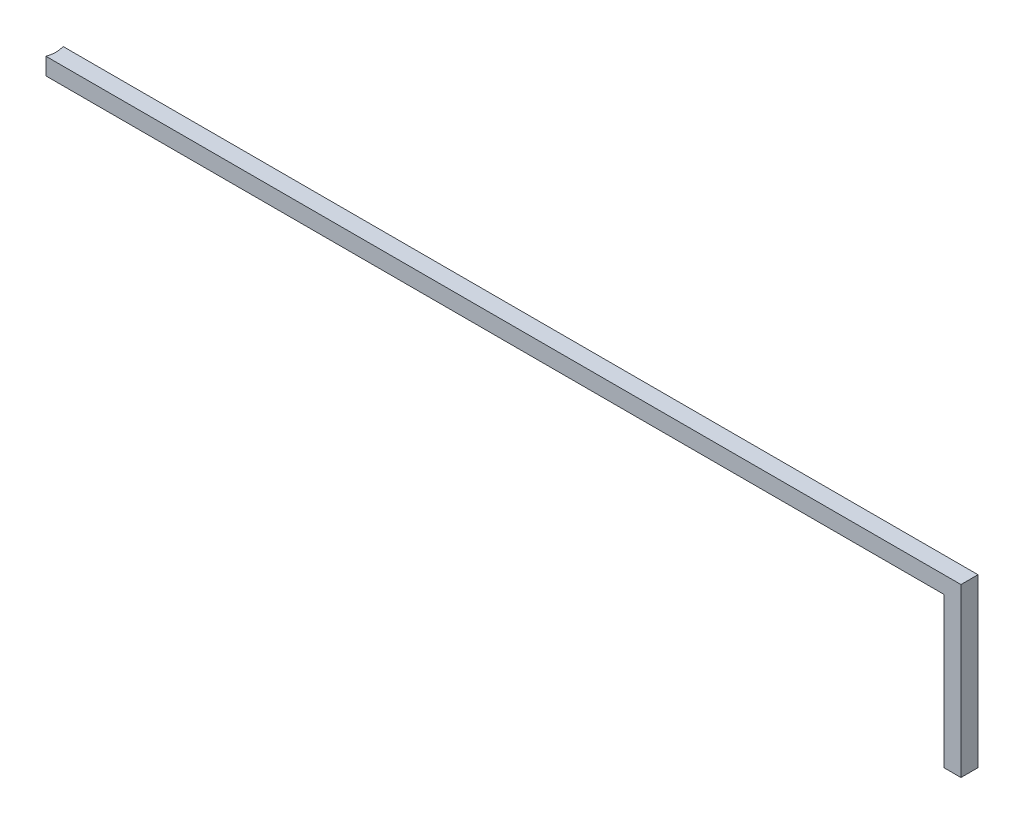
ISO-10303-21;
HEADER;
FILE_DESCRIPTION(('STEP AP214'),'2;1');
FILE_NAME('part.step','',(''),(''),'','','');
FILE_SCHEMA(('AUTOMOTIVE_DESIGN { 1 0 10303 214 1 1 1 1 }'));
ENDSEC;
DATA;
#1=APPLICATION_CONTEXT('core data for automotive mechanical design processes');
#2=APPLICATION_PROTOCOL_DEFINITION('international standard','automotive_design',2000,#1);
#3=PRODUCT_CONTEXT('',#1,'mechanical');
#4=PRODUCT('Part','Part','',(#3));
#5=PRODUCT_RELATED_PRODUCT_CATEGORY('part','',(#4));
#6=PRODUCT_DEFINITION_FORMATION('','',#4);
#7=PRODUCT_DEFINITION_CONTEXT('part definition',#1,'design');
#8=PRODUCT_DEFINITION('design','',#6,#7);
#9=PRODUCT_DEFINITION_SHAPE('','',#8);
#10=(LENGTH_UNIT() NAMED_UNIT(*) SI_UNIT(.MILLI.,.METRE.));
#11=(NAMED_UNIT(*) PLANE_ANGLE_UNIT() SI_UNIT($,.RADIAN.));
#12=(NAMED_UNIT(*) SI_UNIT($,.STERADIAN.) SOLID_ANGLE_UNIT());
#13=UNCERTAINTY_MEASURE_WITH_UNIT(LENGTH_MEASURE(1.E-05),#10,'distance_accuracy_value','');
#14=(GEOMETRIC_REPRESENTATION_CONTEXT(3) GLOBAL_UNCERTAINTY_ASSIGNED_CONTEXT((#13)) GLOBAL_UNIT_ASSIGNED_CONTEXT((#10,
#11,#12)) REPRESENTATION_CONTEXT('',''));
#15=CARTESIAN_POINT('',(0.,0.,0.));
#16=DIRECTION('',(0.,0.,1.));
#17=DIRECTION('',(1.,0.,0.));
#18=AXIS2_PLACEMENT_3D('',#15,#16,#17);
#19=CARTESIAN_POINT('',(77.3845298586437,46.6294366197183,15.5));
#20=DIRECTION('',(-1.,0.,0.));
#21=DIRECTION('',(0.,-1.,0.));
#22=AXIS2_PLACEMENT_3D('',#19,#20,#21);
#23=PLANE('',#22);
#24=DIRECTION('',(0.,1.,0.));
#25=VECTOR('',#24,1.);
#26=CARTESIAN_POINT('',(77.3845298586437,46.6294366197183,0.));
#27=LINE('',#26,#25);
#28=CARTESIAN_POINT('',(77.3845298586438,-105.370563380282,0.));
#29=VERTEX_POINT('',#28);
#30=CARTESIAN_POINT('',(77.3845298586437,46.6294366197183,0.));
#31=VERTEX_POINT('',#30);
#32=EDGE_CURVE('E98',#29,#31,#27,.T.);
#33=ORIENTED_EDGE('',*,*,#32,.T.);
#34=DIRECTION('',(0.,0.,-1.));
#35=VECTOR('',#34,1.);
#36=CARTESIAN_POINT('',(77.3845298586437,46.6294366197183,15.5));
#37=LINE('',#36,#35);
#38=CARTESIAN_POINT('',(77.3845298586437,46.6294366197183,15.5));
#39=VERTEX_POINT('',#38);
#40=EDGE_CURVE('E41',#39,#31,#37,.T.);
#41=ORIENTED_EDGE('',*,*,#40,.F.);
#42=DIRECTION('',(0.,1.,0.));
#43=VECTOR('',#42,1.);
#44=CARTESIAN_POINT('',(77.3845298586437,46.6294366197183,15.5));
#45=LINE('',#44,#43);
#46=CARTESIAN_POINT('',(77.3845298586438,-105.370563380282,15.5));
#47=VERTEX_POINT('',#46);
#48=EDGE_CURVE('E106',#47,#39,#45,.T.);
#49=ORIENTED_EDGE('',*,*,#48,.F.);
#50=DIRECTION('',(0.,0.,-1.));
#51=VECTOR('',#50,1.);
#52=CARTESIAN_POINT('',(77.3845298586438,-105.370563380282,15.5));
#53=LINE('',#52,#51);
#54=EDGE_CURVE('E116',#47,#29,#53,.T.);
#55=ORIENTED_EDGE('',*,*,#54,.T.);
#56=EDGE_LOOP('',(#33,#41,#49,#55));
#57=FACE_BOUND('',#56,.T.);
#58=ADVANCED_FACE('F34',(#57),#23,.F.);
#59=CARTESIAN_POINT('',(-757.034452899738,46.6294366197183,15.5));
#60=DIRECTION('',(0.,-1.,0.));
#61=DIRECTION('',(0.,0.,-1.));
#62=AXIS2_PLACEMENT_3D('',#59,#60,#61);
#63=PLANE('',#62);
#64=DIRECTION('',(-1.,0.,0.));
#65=VECTOR('',#64,1.);
#66=CARTESIAN_POINT('',(-757.034452899738,46.6294366197183,0.));
#67=LINE('',#66,#65);
#68=CARTESIAN_POINT('',(-754.637042126965,46.6294366197183,0.));
#69=VERTEX_POINT('',#68);
#70=EDGE_CURVE('E102',#31,#69,#67,.T.);
#71=ORIENTED_EDGE('',*,*,#70,.T.);
#72=CARTESIAN_POINT('',(-777.351299763965,46.6294366197183,7.74999999999987));
#73=DIRECTION('',(0.,1.,0.));
#74=DIRECTION('',(0.,0.,1.));
#75=AXIS2_PLACEMENT_3D('',#72,#73,#74);
#76=CIRCLE('',#75,23.9999999999996);
#77=CARTESIAN_POINT('',(-754.637042126965,46.6294366197183,15.5));
#78=VERTEX_POINT('',#77);
#79=EDGE_CURVE('E47',#78,#69,#76,.T.);
#80=ORIENTED_EDGE('',*,*,#79,.F.);
#81=DIRECTION('',(-1.,0.,0.));
#82=VECTOR('',#81,1.);
#83=CARTESIAN_POINT('',(-757.034452899738,46.6294366197183,15.5));
#84=LINE('',#83,#82);
#85=EDGE_CURVE('E84',#39,#78,#84,.T.);
#86=ORIENTED_EDGE('',*,*,#85,.F.);
#87=ORIENTED_EDGE('',*,*,#40,.T.);
#88=EDGE_LOOP('',(#71,#80,#86,#87));
#89=FACE_BOUND('',#88,.T.);
#90=ADVANCED_FACE('F101',(#89),#63,.F.);
#91=CARTESIAN_POINT('',(61.8845298586438,31.1294366197183,15.5));
#92=DIRECTION('',(0.,1.,0.));
#93=DIRECTION('',(0.,0.,1.));
#94=AXIS2_PLACEMENT_3D('',#91,#92,#93);
#95=PLANE('',#94);
#96=DIRECTION('',(1.,0.,0.));
#97=VECTOR('',#96,1.);
#98=CARTESIAN_POINT('',(61.8845298586438,31.1294366197183,15.5));
#99=LINE('',#98,#97);
#100=CARTESIAN_POINT('',(-754.637042126965,31.1294366197183,15.5));
#101=VERTEX_POINT('',#100);
#102=CARTESIAN_POINT('',(61.8845298586438,31.1294366197183,15.5));
#103=VERTEX_POINT('',#102);
#104=EDGE_CURVE('E108',#101,#103,#99,.T.);
#105=ORIENTED_EDGE('',*,*,#104,.F.);
#106=CARTESIAN_POINT('',(-777.351299763965,31.1294366197183,7.74999999999987));
#107=DIRECTION('',(0.,1.,0.));
#108=DIRECTION('',(0.,0.,1.));
#109=AXIS2_PLACEMENT_3D('',#106,#107,#108);
#110=CIRCLE('',#109,23.9999999999996);
#111=CARTESIAN_POINT('',(-754.637042126965,31.1294366197183,0.));
#112=VERTEX_POINT('',#111);
#113=EDGE_CURVE('E96',#101,#112,#110,.T.);
#114=ORIENTED_EDGE('',*,*,#113,.T.);
#115=DIRECTION('',(1.,0.,0.));
#116=VECTOR('',#115,1.);
#117=CARTESIAN_POINT('',(61.8845298586438,31.1294366197183,0.));
#118=LINE('',#117,#116);
#119=CARTESIAN_POINT('',(61.8845298586438,31.1294366197183,0.));
#120=VERTEX_POINT('',#119);
#121=EDGE_CURVE('E120',#112,#120,#118,.T.);
#122=ORIENTED_EDGE('',*,*,#121,.T.);
#123=DIRECTION('',(0.,0.,-1.));
#124=VECTOR('',#123,1.);
#125=CARTESIAN_POINT('',(61.8845298586438,31.1294366197183,15.5));
#126=LINE('',#125,#124);
#127=EDGE_CURVE('E128',#103,#120,#126,.T.);
#128=ORIENTED_EDGE('',*,*,#127,.F.);
#129=EDGE_LOOP('',(#105,#114,#122,#128));
#130=FACE_BOUND('',#129,.T.);
#131=ADVANCED_FACE('F137',(#130),#95,.F.);
#132=CARTESIAN_POINT('',(61.8845298586438,-105.370563380282,15.5));
#133=DIRECTION('',(1.,0.,0.));
#134=DIRECTION('',(0.,0.,-1.));
#135=AXIS2_PLACEMENT_3D('',#132,#133,#134);
#136=PLANE('',#135);
#137=DIRECTION('',(0.,-1.,0.));
#138=VECTOR('',#137,1.);
#139=CARTESIAN_POINT('',(61.8845298586438,-105.370563380282,0.));
#140=LINE('',#139,#138);
#141=CARTESIAN_POINT('',(61.8845298586438,-105.370563380282,0.));
#142=VERTEX_POINT('',#141);
#143=EDGE_CURVE('E122',#120,#142,#140,.T.);
#144=ORIENTED_EDGE('',*,*,#143,.T.);
#145=DIRECTION('',(0.,0.,-1.));
#146=VECTOR('',#145,1.);
#147=CARTESIAN_POINT('',(61.8845298586438,-105.370563380282,15.5));
#148=LINE('',#147,#146);
#149=CARTESIAN_POINT('',(61.8845298586438,-105.370563380282,15.5));
#150=VERTEX_POINT('',#149);
#151=EDGE_CURVE('E126',#150,#142,#148,.T.);
#152=ORIENTED_EDGE('',*,*,#151,.F.);
#153=DIRECTION('',(0.,-1.,0.));
#154=VECTOR('',#153,1.);
#155=CARTESIAN_POINT('',(61.8845298586438,-105.370563380282,15.5));
#156=LINE('',#155,#154);
#157=EDGE_CURVE('E110',#103,#150,#156,.T.);
#158=ORIENTED_EDGE('',*,*,#157,.F.);
#159=ORIENTED_EDGE('',*,*,#127,.T.);
#160=EDGE_LOOP('',(#144,#152,#158,#159));
#161=FACE_BOUND('',#160,.T.);
#162=ADVANCED_FACE('F143',(#161),#136,.F.);
#163=CARTESIAN_POINT('',(77.3845298586438,-105.370563380282,15.5));
#164=DIRECTION('',(0.,1.,0.));
#165=DIRECTION('',(0.,0.,1.));
#166=AXIS2_PLACEMENT_3D('',#163,#164,#165);
#167=PLANE('',#166);
#168=DIRECTION('',(1.,0.,0.));
#169=VECTOR('',#168,1.);
#170=CARTESIAN_POINT('',(77.3845298586438,-105.370563380282,0.));
#171=LINE('',#170,#169);
#172=EDGE_CURVE('E77',#142,#29,#171,.T.);
#173=ORIENTED_EDGE('',*,*,#172,.T.);
#174=ORIENTED_EDGE('',*,*,#54,.F.);
#175=DIRECTION('',(1.,0.,0.));
#176=VECTOR('',#175,1.);
#177=CARTESIAN_POINT('',(77.3845298586438,-105.370563380282,15.5));
#178=LINE('',#177,#176);
#179=EDGE_CURVE('E56',#150,#47,#178,.T.);
#180=ORIENTED_EDGE('',*,*,#179,.F.);
#181=ORIENTED_EDGE('',*,*,#151,.T.);
#182=EDGE_LOOP('',(#173,#174,#180,#181));
#183=FACE_BOUND('',#182,.T.);
#184=ADVANCED_FACE('F144',(#183),#167,.F.);
#185=CARTESIAN_POINT('',(0.,0.,15.5));
#186=DIRECTION('',(0.,0.,-1.));
#187=DIRECTION('',(-1.,0.,0.));
#188=AXIS2_PLACEMENT_3D('',#185,#186,#187);
#189=PLANE('',#188);
#190=ORIENTED_EDGE('',*,*,#85,.T.);
#191=DIRECTION('',(0.,1.,0.));
#192=VECTOR('',#191,1.);
#193=CARTESIAN_POINT('',(-754.637042126965,31.1294366197183,15.5));
#194=LINE('',#193,#192);
#195=EDGE_CURVE('E93',#78,#101,#194,.F.);
#196=ORIENTED_EDGE('',*,*,#195,.T.);
#197=ORIENTED_EDGE('',*,*,#104,.T.);
#198=ORIENTED_EDGE('',*,*,#157,.T.);
#199=ORIENTED_EDGE('',*,*,#179,.T.);
#200=ORIENTED_EDGE('',*,*,#48,.T.);
#201=EDGE_LOOP('',(#190,#196,#197,#198,#199,#200));
#202=FACE_BOUND('',#201,.T.);
#203=ADVANCED_FACE('F104',(#202),#189,.F.);
#204=CARTESIAN_POINT('',(0.,0.,0.));
#205=DIRECTION('',(0.,0.,-1.));
#206=DIRECTION('',(-1.,0.,0.));
#207=AXIS2_PLACEMENT_3D('',#204,#205,#206);
#208=PLANE('',#207);
#209=DIRECTION('',(0.,1.,0.));
#210=VECTOR('',#209,1.);
#211=CARTESIAN_POINT('',(-754.637042126965,31.1294366197183,0.));
#212=LINE('',#211,#210);
#213=EDGE_CURVE('E11',#69,#112,#212,.F.);
#214=ORIENTED_EDGE('',*,*,#213,.F.);
#215=ORIENTED_EDGE('',*,*,#70,.F.);
#216=ORIENTED_EDGE('',*,*,#32,.F.);
#217=ORIENTED_EDGE('',*,*,#172,.F.);
#218=ORIENTED_EDGE('',*,*,#143,.F.);
#219=ORIENTED_EDGE('',*,*,#121,.F.);
#220=EDGE_LOOP('',(#214,#215,#216,#217,#218,#219));
#221=FACE_BOUND('',#220,.T.);
#222=ADVANCED_FACE('F133',(#221),#208,.T.);
#223=CARTESIAN_POINT('',(-777.351299763965,31.1294366197183,7.74999999999987));
#224=DIRECTION('',(0.,1.,0.));
#225=DIRECTION('',(0.,0.,1.));
#226=AXIS2_PLACEMENT_3D('',#223,#224,#225);
#227=CYLINDRICAL_SURFACE('',#226,23.9999999999996);
#228=ORIENTED_EDGE('',*,*,#79,.T.);
#229=ORIENTED_EDGE('',*,*,#213,.T.);
#230=ORIENTED_EDGE('',*,*,#113,.F.);
#231=ORIENTED_EDGE('',*,*,#195,.F.);
#232=EDGE_LOOP('',(#228,#229,#230,#231));
#233=FACE_BOUND('',#232,.T.);
#234=ADVANCED_FACE('F94',(#233),#227,.F.);
#235=CLOSED_SHELL('',(#58,#90,#131,#162,#184,#203,#222,#234));
#236=MANIFOLD_SOLID_BREP('B2',#235);
#237=ADVANCED_BREP_SHAPE_REPRESENTATION('',(#18,#236),#14);
#238=SHAPE_DEFINITION_REPRESENTATION(#9,#237);
ENDSEC;
END-ISO-10303-21;
